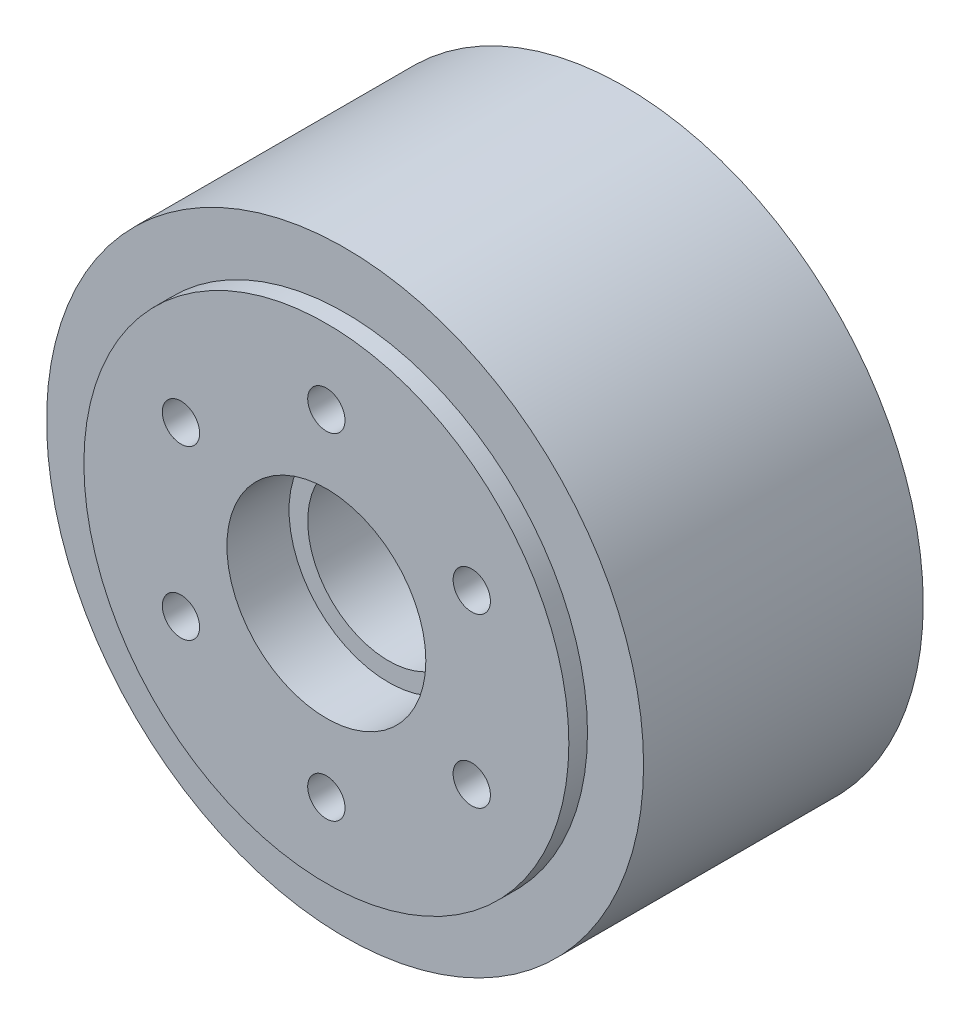
ISO-10303-21;
HEADER;
FILE_DESCRIPTION(('STEP AP214'),'2;1');
FILE_NAME('part.step','',(''),(''),'','','');
FILE_SCHEMA(('AUTOMOTIVE_DESIGN { 1 0 10303 214 1 1 1 1 }'));
ENDSEC;
DATA;
#1=APPLICATION_CONTEXT('core data for automotive mechanical design processes');
#2=APPLICATION_PROTOCOL_DEFINITION('international standard','automotive_design',2000,#1);
#3=PRODUCT_CONTEXT('',#1,'mechanical');
#4=PRODUCT('Part','Part','',(#3));
#5=PRODUCT_RELATED_PRODUCT_CATEGORY('part','',(#4));
#6=PRODUCT_DEFINITION_FORMATION('','',#4);
#7=PRODUCT_DEFINITION_CONTEXT('part definition',#1,'design');
#8=PRODUCT_DEFINITION('design','',#6,#7);
#9=PRODUCT_DEFINITION_SHAPE('','',#8);
#10=(LENGTH_UNIT() NAMED_UNIT(*) SI_UNIT(.MILLI.,.METRE.));
#11=(NAMED_UNIT(*) PLANE_ANGLE_UNIT() SI_UNIT($,.RADIAN.));
#12=(NAMED_UNIT(*) SI_UNIT($,.STERADIAN.) SOLID_ANGLE_UNIT());
#13=UNCERTAINTY_MEASURE_WITH_UNIT(LENGTH_MEASURE(1.E-05),#10,'distance_accuracy_value','');
#14=(GEOMETRIC_REPRESENTATION_CONTEXT(3) GLOBAL_UNCERTAINTY_ASSIGNED_CONTEXT((#13)) GLOBAL_UNIT_ASSIGNED_CONTEXT((#10,
#11,#12)) REPRESENTATION_CONTEXT('',''));
#15=CARTESIAN_POINT('',(0.,0.,0.));
#16=DIRECTION('',(0.,0.,1.));
#17=DIRECTION('',(1.,0.,0.));
#18=AXIS2_PLACEMENT_3D('',#15,#16,#17);
#19=CARTESIAN_POINT('',(0.,48.01,-47.99));
#20=DIRECTION('',(0.,0.,1.));
#21=DIRECTION('',(1.,0.,0.));
#22=AXIS2_PLACEMENT_3D('',#19,#20,#21);
#23=PLANE('',#22);
#24=CARTESIAN_POINT('',(0.,0.,-47.99));
#25=DIRECTION('',(0.,0.,1.));
#26=DIRECTION('',(1.,0.,0.));
#27=AXIS2_PLACEMENT_3D('',#24,#25,#26);
#28=CIRCLE('',#27,48.01);
#29=CARTESIAN_POINT('',(48.01,0.,-47.99));
#30=VERTEX_POINT('',#29);
#31=EDGE_CURVE('E55',#30,#30,#28,.T.);
#32=ORIENTED_EDGE('',*,*,#31,.F.);
#33=EDGE_LOOP('',(#32));
#34=FACE_BOUND('',#33,.T.);
#35=CARTESIAN_POINT('',(0.,0.,-47.99));
#36=DIRECTION('',(0.,0.,1.));
#37=DIRECTION('',(1.,0.,0.));
#38=AXIS2_PLACEMENT_3D('',#35,#36,#37);
#39=CIRCLE('',#38,36.01);
#40=CARTESIAN_POINT('',(36.01,0.,-47.99));
#41=VERTEX_POINT('',#40);
#42=EDGE_CURVE('E11',#41,#41,#39,.T.);
#43=ORIENTED_EDGE('',*,*,#42,.T.);
#44=EDGE_LOOP('',(#43));
#45=FACE_BOUND('',#44,.T.);
#46=ADVANCED_FACE('F41',(#34,#45),#23,.F.);
#47=CARTESIAN_POINT('',(0.,0.,0.));
#48=DIRECTION('',(0.,0.,1.));
#49=DIRECTION('',(1.,0.,0.));
#50=AXIS2_PLACEMENT_3D('',#47,#48,#49);
#51=CYLINDRICAL_SURFACE('',#50,36.01);
#52=ORIENTED_EDGE('',*,*,#42,.F.);
#53=EDGE_LOOP('',(#52));
#54=FACE_BOUND('',#53,.T.);
#55=CARTESIAN_POINT('',(0.,0.,-3.01));
#56=DIRECTION('',(0.,0.,1.));
#57=DIRECTION('',(1.,0.,0.));
#58=AXIS2_PLACEMENT_3D('',#55,#56,#57);
#59=CIRCLE('',#58,36.01);
#60=CARTESIAN_POINT('',(36.01,0.,-3.01));
#61=VERTEX_POINT('',#60);
#62=EDGE_CURVE('E47',#61,#61,#59,.T.);
#63=ORIENTED_EDGE('',*,*,#62,.T.);
#64=EDGE_LOOP('',(#63));
#65=FACE_BOUND('',#64,.T.);
#66=ADVANCED_FACE('F64',(#54,#65),#51,.F.);
#67=CARTESIAN_POINT('',(0.,36.01,-3.01));
#68=DIRECTION('',(0.,0.,-1.));
#69=DIRECTION('',(-1.,0.,0.));
#70=AXIS2_PLACEMENT_3D('',#67,#68,#69);
#71=PLANE('',#70);
#72=ORIENTED_EDGE('',*,*,#62,.F.);
#73=EDGE_LOOP('',(#72));
#74=FACE_BOUND('',#73,.T.);
#75=CARTESIAN_POINT('',(0.,0.,-3.01));
#76=DIRECTION('',(0.,0.,1.));
#77=DIRECTION('',(1.,0.,0.));
#78=AXIS2_PLACEMENT_3D('',#75,#76,#77);
#79=CIRCLE('',#78,48.01);
#80=CARTESIAN_POINT('',(48.01,0.,-3.01));
#81=VERTEX_POINT('',#80);
#82=EDGE_CURVE('E51',#81,#81,#79,.T.);
#83=ORIENTED_EDGE('',*,*,#82,.T.);
#84=EDGE_LOOP('',(#83));
#85=FACE_BOUND('',#84,.T.);
#86=ADVANCED_FACE('F68',(#74,#85),#71,.F.);
#87=CARTESIAN_POINT('',(0.,0.,0.));
#88=DIRECTION('',(0.,0.,1.));
#89=DIRECTION('',(1.,0.,0.));
#90=AXIS2_PLACEMENT_3D('',#87,#88,#89);
#91=CYLINDRICAL_SURFACE('',#90,48.01);
#92=ORIENTED_EDGE('',*,*,#82,.F.);
#93=EDGE_LOOP('',(#92));
#94=FACE_BOUND('',#93,.T.);
#95=ORIENTED_EDGE('',*,*,#31,.T.);
#96=EDGE_LOOP('',(#95));
#97=FACE_BOUND('',#96,.T.);
#98=ADVANCED_FACE('F61',(#94,#97),#91,.T.);
#99=CLOSED_SHELL('',(#46,#66,#86,#98));
#100=MANIFOLD_SOLID_BREP('B2',#99);
#101=CARTESIAN_POINT('',(0.,0.,0.));
#102=DIRECTION('',(0.,0.,1.));
#103=DIRECTION('',(1.,0.,0.));
#104=AXIS2_PLACEMENT_3D('',#101,#102,#103);
#105=CYLINDRICAL_SURFACE('',#104,39.);
#106=CARTESIAN_POINT('',(0.,0.,0.));
#107=DIRECTION('',(0.,0.,1.));
#108=DIRECTION('',(1.,0.,0.));
#109=AXIS2_PLACEMENT_3D('',#106,#107,#108);
#110=CIRCLE('',#109,39.);
#111=CARTESIAN_POINT('',(39.,0.,0.));
#112=VERTEX_POINT('',#111);
#113=EDGE_CURVE('E137',#112,#112,#110,.T.);
#114=ORIENTED_EDGE('',*,*,#113,.F.);
#115=EDGE_LOOP('',(#114));
#116=FACE_BOUND('',#115,.T.);
#117=CARTESIAN_POINT('',(0.,0.,-3.));
#118=DIRECTION('',(0.,0.,1.));
#119=DIRECTION('',(1.,0.,0.));
#120=AXIS2_PLACEMENT_3D('',#117,#118,#119);
#121=CIRCLE('',#120,39.);
#122=CARTESIAN_POINT('',(39.,0.,-3.));
#123=VERTEX_POINT('',#122);
#124=EDGE_CURVE('E40',#123,#123,#121,.T.);
#125=ORIENTED_EDGE('',*,*,#124,.T.);
#126=EDGE_LOOP('',(#125));
#127=FACE_BOUND('',#126,.T.);
#128=ADVANCED_FACE('F103',(#116,#127),#105,.T.);
#129=CARTESIAN_POINT('',(0.,39.,-3.));
#130=DIRECTION('',(0.,0.,1.));
#131=DIRECTION('',(1.,0.,0.));
#132=AXIS2_PLACEMENT_3D('',#129,#130,#131);
#133=PLANE('',#132);
#134=ORIENTED_EDGE('',*,*,#124,.F.);
#135=EDGE_LOOP('',(#134));
#136=FACE_BOUND('',#135,.T.);
#137=CARTESIAN_POINT('',(0.,0.,-3.));
#138=DIRECTION('',(0.,0.,1.));
#139=DIRECTION('',(1.,0.,0.));
#140=AXIS2_PLACEMENT_3D('',#137,#138,#139);
#141=CIRCLE('',#140,36.);
#142=CARTESIAN_POINT('',(36.,0.,-3.));
#143=VERTEX_POINT('',#142);
#144=EDGE_CURVE('E109',#143,#143,#141,.T.);
#145=ORIENTED_EDGE('',*,*,#144,.T.);
#146=EDGE_LOOP('',(#145));
#147=FACE_BOUND('',#146,.T.);
#148=ADVANCED_FACE('F208',(#136,#147),#133,.F.);
#149=CARTESIAN_POINT('',(0.,0.,0.));
#150=DIRECTION('',(0.,0.,1.));
#151=DIRECTION('',(1.,0.,0.));
#152=AXIS2_PLACEMENT_3D('',#149,#150,#151);
#153=CYLINDRICAL_SURFACE('',#152,36.);
#154=ORIENTED_EDGE('',*,*,#144,.F.);
#155=EDGE_LOOP('',(#154));
#156=FACE_BOUND('',#155,.T.);
#157=CARTESIAN_POINT('',(0.,0.,-48.));
#158=DIRECTION('',(0.,0.,1.));
#159=DIRECTION('',(1.,0.,0.));
#160=AXIS2_PLACEMENT_3D('',#157,#158,#159);
#161=CIRCLE('',#160,36.);
#162=CARTESIAN_POINT('',(36.,0.,-48.));
#163=VERTEX_POINT('',#162);
#164=EDGE_CURVE('E113',#163,#163,#161,.T.);
#165=ORIENTED_EDGE('',*,*,#164,.T.);
#166=EDGE_LOOP('',(#165));
#167=FACE_BOUND('',#166,.T.);
#168=ADVANCED_FACE('F212',(#156,#167),#153,.T.);
#169=CARTESIAN_POINT('',(0.,36.,-48.));
#170=DIRECTION('',(0.,0.,1.));
#171=DIRECTION('',(1.,0.,0.));
#172=AXIS2_PLACEMENT_3D('',#169,#170,#171);
#173=PLANE('',#172);
#174=CARTESIAN_POINT('',(0.,27.,-48.));
#175=DIRECTION('',(0.,0.,1.));
#176=DIRECTION('',(1.,0.,0.));
#177=AXIS2_PLACEMENT_3D('',#174,#175,#176);
#178=CIRCLE('',#177,3.);
#179=CARTESIAN_POINT('',(3.,27.,-48.));
#180=VERTEX_POINT('',#179);
#181=EDGE_CURVE('E140',#180,#180,#178,.T.);
#182=ORIENTED_EDGE('',*,*,#181,.T.);
#183=EDGE_LOOP('',(#182));
#184=FACE_BOUND('',#183,.T.);
#185=CARTESIAN_POINT('',(-23.3826859021799,13.5,-48.));
#186=DIRECTION('',(0.,0.,1.));
#187=DIRECTION('',(1.,0.,0.));
#188=AXIS2_PLACEMENT_3D('',#185,#186,#187);
#189=CIRCLE('',#188,3.);
#190=CARTESIAN_POINT('',(-20.3826859021798,13.5,-48.));
#191=VERTEX_POINT('',#190);
#192=EDGE_CURVE('E145',#191,#191,#189,.T.);
#193=ORIENTED_EDGE('',*,*,#192,.T.);
#194=EDGE_LOOP('',(#193));
#195=FACE_BOUND('',#194,.T.);
#196=CARTESIAN_POINT('',(-23.3826859021798,-13.5,-48.));
#197=DIRECTION('',(0.,0.,1.));
#198=DIRECTION('',(1.,0.,0.));
#199=AXIS2_PLACEMENT_3D('',#196,#197,#198);
#200=CIRCLE('',#199,3.);
#201=CARTESIAN_POINT('',(-20.3826859021798,-13.5,-48.));
#202=VERTEX_POINT('',#201);
#203=EDGE_CURVE('E144',#202,#202,#200,.T.);
#204=ORIENTED_EDGE('',*,*,#203,.T.);
#205=EDGE_LOOP('',(#204));
#206=FACE_BOUND('',#205,.T.);
#207=CARTESIAN_POINT('',(0.,-27.,-48.));
#208=DIRECTION('',(0.,0.,1.));
#209=DIRECTION('',(1.,0.,0.));
#210=AXIS2_PLACEMENT_3D('',#207,#208,#209);
#211=CIRCLE('',#210,3.);
#212=CARTESIAN_POINT('',(3.,-27.,-48.));
#213=VERTEX_POINT('',#212);
#214=EDGE_CURVE('E151',#213,#213,#211,.T.);
#215=ORIENTED_EDGE('',*,*,#214,.T.);
#216=EDGE_LOOP('',(#215));
#217=FACE_BOUND('',#216,.T.);
#218=CARTESIAN_POINT('',(23.3826859021798,-13.5,-48.));
#219=DIRECTION('',(0.,0.,1.));
#220=DIRECTION('',(1.,0.,0.));
#221=AXIS2_PLACEMENT_3D('',#218,#219,#220);
#222=CIRCLE('',#221,3.);
#223=CARTESIAN_POINT('',(26.3826859021798,-13.5,-48.));
#224=VERTEX_POINT('',#223);
#225=EDGE_CURVE('E157',#224,#224,#222,.T.);
#226=ORIENTED_EDGE('',*,*,#225,.T.);
#227=EDGE_LOOP('',(#226));
#228=FACE_BOUND('',#227,.T.);
#229=CARTESIAN_POINT('',(23.3826859021798,13.5,-48.));
#230=DIRECTION('',(0.,0.,1.));
#231=DIRECTION('',(1.,0.,0.));
#232=AXIS2_PLACEMENT_3D('',#229,#230,#231);
#233=CIRCLE('',#232,3.);
#234=CARTESIAN_POINT('',(26.3826859021798,13.5,-48.));
#235=VERTEX_POINT('',#234);
#236=EDGE_CURVE('E163',#235,#235,#233,.T.);
#237=ORIENTED_EDGE('',*,*,#236,.T.);
#238=EDGE_LOOP('',(#237));
#239=FACE_BOUND('',#238,.T.);
#240=ORIENTED_EDGE('',*,*,#164,.F.);
#241=EDGE_LOOP('',(#240));
#242=FACE_BOUND('',#241,.T.);
#243=CARTESIAN_POINT('',(0.,0.,-48.));
#244=DIRECTION('',(0.,0.,1.));
#245=DIRECTION('',(1.,0.,0.));
#246=AXIS2_PLACEMENT_3D('',#243,#244,#245);
#247=CIRCLE('',#246,16.);
#248=CARTESIAN_POINT('',(16.,0.,-48.));
#249=VERTEX_POINT('',#248);
#250=EDGE_CURVE('E117',#249,#249,#247,.T.);
#251=ORIENTED_EDGE('',*,*,#250,.T.);
#252=EDGE_LOOP('',(#251));
#253=FACE_BOUND('',#252,.T.);
#254=ADVANCED_FACE('F177',(#184,#195,#206,#217,#228,#239,#242,#253),#173,.F.);
#255=CARTESIAN_POINT('',(0.,0.,0.));
#256=DIRECTION('',(0.,0.,1.));
#257=DIRECTION('',(1.,0.,0.));
#258=AXIS2_PLACEMENT_3D('',#255,#256,#257);
#259=CYLINDRICAL_SURFACE('',#258,16.);
#260=ORIENTED_EDGE('',*,*,#250,.F.);
#261=EDGE_LOOP('',(#260));
#262=FACE_BOUND('',#261,.T.);
#263=CARTESIAN_POINT('',(0.,0.,-38.));
#264=DIRECTION('',(0.,0.,1.));
#265=DIRECTION('',(1.,0.,0.));
#266=AXIS2_PLACEMENT_3D('',#263,#264,#265);
#267=CIRCLE('',#266,16.);
#268=CARTESIAN_POINT('',(16.,0.,-38.));
#269=VERTEX_POINT('',#268);
#270=EDGE_CURVE('E122',#269,#269,#267,.T.);
#271=ORIENTED_EDGE('',*,*,#270,.T.);
#272=EDGE_LOOP('',(#271));
#273=FACE_BOUND('',#272,.T.);
#274=ADVANCED_FACE('F222',(#262,#273),#259,.F.);
#275=CARTESIAN_POINT('',(0.,16.,-38.));
#276=DIRECTION('',(0.,0.,1.));
#277=DIRECTION('',(1.,0.,0.));
#278=AXIS2_PLACEMENT_3D('',#275,#276,#277);
#279=PLANE('',#278);
#280=ORIENTED_EDGE('',*,*,#270,.F.);
#281=EDGE_LOOP('',(#280));
#282=FACE_BOUND('',#281,.T.);
#283=CARTESIAN_POINT('',(0.,0.,-38.));
#284=DIRECTION('',(0.,0.,1.));
#285=DIRECTION('',(1.,0.,0.));
#286=AXIS2_PLACEMENT_3D('',#283,#284,#285);
#287=CIRCLE('',#286,13.);
#288=CARTESIAN_POINT('',(13.,0.,-38.));
#289=VERTEX_POINT('',#288);
#290=EDGE_CURVE('E125',#289,#289,#287,.T.);
#291=ORIENTED_EDGE('',*,*,#290,.T.);
#292=EDGE_LOOP('',(#291));
#293=FACE_BOUND('',#292,.T.);
#294=ADVANCED_FACE('F225',(#282,#293),#279,.F.);
#295=CARTESIAN_POINT('',(0.,0.,0.));
#296=DIRECTION('',(0.,0.,1.));
#297=DIRECTION('',(1.,0.,0.));
#298=AXIS2_PLACEMENT_3D('',#295,#296,#297);
#299=CYLINDRICAL_SURFACE('',#298,13.);
#300=ORIENTED_EDGE('',*,*,#290,.F.);
#301=EDGE_LOOP('',(#300));
#302=FACE_BOUND('',#301,.T.);
#303=CARTESIAN_POINT('',(0.,0.,-10.));
#304=DIRECTION('',(0.,0.,1.));
#305=DIRECTION('',(1.,0.,0.));
#306=AXIS2_PLACEMENT_3D('',#303,#304,#305);
#307=CIRCLE('',#306,13.);
#308=CARTESIAN_POINT('',(13.,0.,-10.));
#309=VERTEX_POINT('',#308);
#310=EDGE_CURVE('E128',#309,#309,#307,.T.);
#311=ORIENTED_EDGE('',*,*,#310,.T.);
#312=EDGE_LOOP('',(#311));
#313=FACE_BOUND('',#312,.T.);
#314=ADVANCED_FACE('F229',(#302,#313),#299,.F.);
#315=CARTESIAN_POINT('',(0.,13.,-10.));
#316=DIRECTION('',(0.,0.,-1.));
#317=DIRECTION('',(-1.,0.,0.));
#318=AXIS2_PLACEMENT_3D('',#315,#316,#317);
#319=PLANE('',#318);
#320=ORIENTED_EDGE('',*,*,#310,.F.);
#321=EDGE_LOOP('',(#320));
#322=FACE_BOUND('',#321,.T.);
#323=CARTESIAN_POINT('',(0.,0.,-10.));
#324=DIRECTION('',(0.,0.,1.));
#325=DIRECTION('',(1.,0.,0.));
#326=AXIS2_PLACEMENT_3D('',#323,#324,#325);
#327=CIRCLE('',#326,16.);
#328=CARTESIAN_POINT('',(16.,0.,-10.));
#329=VERTEX_POINT('',#328);
#330=EDGE_CURVE('E131',#329,#329,#327,.T.);
#331=ORIENTED_EDGE('',*,*,#330,.T.);
#332=EDGE_LOOP('',(#331));
#333=FACE_BOUND('',#332,.T.);
#334=ADVANCED_FACE('F233',(#322,#333),#319,.F.);
#335=CARTESIAN_POINT('',(0.,0.,0.));
#336=DIRECTION('',(0.,0.,1.));
#337=DIRECTION('',(1.,0.,0.));
#338=AXIS2_PLACEMENT_3D('',#335,#336,#337);
#339=CYLINDRICAL_SURFACE('',#338,16.);
#340=ORIENTED_EDGE('',*,*,#330,.F.);
#341=EDGE_LOOP('',(#340));
#342=FACE_BOUND('',#341,.T.);
#343=CARTESIAN_POINT('',(0.,0.,0.));
#344=DIRECTION('',(0.,0.,1.));
#345=DIRECTION('',(1.,0.,0.));
#346=AXIS2_PLACEMENT_3D('',#343,#344,#345);
#347=CIRCLE('',#346,16.);
#348=CARTESIAN_POINT('',(16.,0.,0.));
#349=VERTEX_POINT('',#348);
#350=EDGE_CURVE('E134',#349,#349,#347,.T.);
#351=ORIENTED_EDGE('',*,*,#350,.T.);
#352=EDGE_LOOP('',(#351));
#353=FACE_BOUND('',#352,.T.);
#354=ADVANCED_FACE('F191',(#342,#353),#339,.F.);
#355=CARTESIAN_POINT('',(0.,16.,0.));
#356=DIRECTION('',(0.,0.,-1.));
#357=DIRECTION('',(-1.,0.,0.));
#358=AXIS2_PLACEMENT_3D('',#355,#356,#357);
#359=PLANE('',#358);
#360=CARTESIAN_POINT('',(0.,27.,0.));
#361=DIRECTION('',(0.,0.,1.));
#362=DIRECTION('',(1.,0.,0.));
#363=AXIS2_PLACEMENT_3D('',#360,#361,#362);
#364=CIRCLE('',#363,3.);
#365=CARTESIAN_POINT('',(3.,27.,0.));
#366=VERTEX_POINT('',#365);
#367=EDGE_CURVE('E166',#366,#366,#364,.T.);
#368=ORIENTED_EDGE('',*,*,#367,.F.);
#369=EDGE_LOOP('',(#368));
#370=FACE_BOUND('',#369,.T.);
#371=CARTESIAN_POINT('',(-23.3826859021799,13.5,0.));
#372=DIRECTION('',(0.,0.,1.));
#373=DIRECTION('',(1.,0.,0.));
#374=AXIS2_PLACEMENT_3D('',#371,#372,#373);
#375=CIRCLE('',#374,3.);
#376=CARTESIAN_POINT('',(-20.3826859021798,13.5,0.));
#377=VERTEX_POINT('',#376);
#378=EDGE_CURVE('E167',#377,#377,#375,.T.);
#379=ORIENTED_EDGE('',*,*,#378,.F.);
#380=EDGE_LOOP('',(#379));
#381=FACE_BOUND('',#380,.T.);
#382=CARTESIAN_POINT('',(-23.3826859021798,-13.5,0.));
#383=DIRECTION('',(0.,0.,1.));
#384=DIRECTION('',(1.,0.,0.));
#385=AXIS2_PLACEMENT_3D('',#382,#383,#384);
#386=CIRCLE('',#385,3.);
#387=CARTESIAN_POINT('',(-20.3826859021798,-13.5,0.));
#388=VERTEX_POINT('',#387);
#389=EDGE_CURVE('E141',#388,#388,#386,.T.);
#390=ORIENTED_EDGE('',*,*,#389,.F.);
#391=EDGE_LOOP('',(#390));
#392=FACE_BOUND('',#391,.T.);
#393=CARTESIAN_POINT('',(0.,-27.,0.));
#394=DIRECTION('',(0.,0.,1.));
#395=DIRECTION('',(1.,0.,0.));
#396=AXIS2_PLACEMENT_3D('',#393,#394,#395);
#397=CIRCLE('',#396,3.);
#398=CARTESIAN_POINT('',(3.,-27.,0.));
#399=VERTEX_POINT('',#398);
#400=EDGE_CURVE('E148',#399,#399,#397,.T.);
#401=ORIENTED_EDGE('',*,*,#400,.F.);
#402=EDGE_LOOP('',(#401));
#403=FACE_BOUND('',#402,.T.);
#404=CARTESIAN_POINT('',(23.3826859021798,-13.5,0.));
#405=DIRECTION('',(0.,0.,1.));
#406=DIRECTION('',(1.,0.,0.));
#407=AXIS2_PLACEMENT_3D('',#404,#405,#406);
#408=CIRCLE('',#407,3.);
#409=CARTESIAN_POINT('',(26.3826859021798,-13.5,0.));
#410=VERTEX_POINT('',#409);
#411=EDGE_CURVE('E154',#410,#410,#408,.T.);
#412=ORIENTED_EDGE('',*,*,#411,.F.);
#413=EDGE_LOOP('',(#412));
#414=FACE_BOUND('',#413,.T.);
#415=CARTESIAN_POINT('',(23.3826859021798,13.5,0.));
#416=DIRECTION('',(0.,0.,1.));
#417=DIRECTION('',(1.,0.,0.));
#418=AXIS2_PLACEMENT_3D('',#415,#416,#417);
#419=CIRCLE('',#418,3.);
#420=CARTESIAN_POINT('',(26.3826859021798,13.5,0.));
#421=VERTEX_POINT('',#420);
#422=EDGE_CURVE('E160',#421,#421,#419,.T.);
#423=ORIENTED_EDGE('',*,*,#422,.F.);
#424=EDGE_LOOP('',(#423));
#425=FACE_BOUND('',#424,.T.);
#426=ORIENTED_EDGE('',*,*,#350,.F.);
#427=EDGE_LOOP('',(#426));
#428=FACE_BOUND('',#427,.T.);
#429=ORIENTED_EDGE('',*,*,#113,.T.);
#430=EDGE_LOOP('',(#429));
#431=FACE_BOUND('',#430,.T.);
#432=ADVANCED_FACE('F187',(#370,#381,#392,#403,#414,#425,#428,#431),#359,.F.);
#433=CARTESIAN_POINT('',(23.3826859021798,13.5,-48.));
#434=DIRECTION('',(0.,0.,1.));
#435=DIRECTION('',(1.,0.,0.));
#436=AXIS2_PLACEMENT_3D('',#433,#434,#435);
#437=CYLINDRICAL_SURFACE('',#436,3.);
#438=ORIENTED_EDGE('',*,*,#236,.F.);
#439=EDGE_LOOP('',(#438));
#440=FACE_BOUND('',#439,.T.);
#441=ORIENTED_EDGE('',*,*,#422,.T.);
#442=EDGE_LOOP('',(#441));
#443=FACE_BOUND('',#442,.T.);
#444=ADVANCED_FACE('F190',(#440,#443),#437,.F.);
#445=CARTESIAN_POINT('',(23.3826859021798,-13.5,-48.));
#446=DIRECTION('',(0.,0.,1.));
#447=DIRECTION('',(1.,0.,0.));
#448=AXIS2_PLACEMENT_3D('',#445,#446,#447);
#449=CYLINDRICAL_SURFACE('',#448,3.);
#450=ORIENTED_EDGE('',*,*,#225,.F.);
#451=EDGE_LOOP('',(#450));
#452=FACE_BOUND('',#451,.T.);
#453=ORIENTED_EDGE('',*,*,#411,.T.);
#454=EDGE_LOOP('',(#453));
#455=FACE_BOUND('',#454,.T.);
#456=ADVANCED_FACE('F248',(#452,#455),#449,.F.);
#457=CARTESIAN_POINT('',(0.,-27.,-48.));
#458=DIRECTION('',(0.,0.,1.));
#459=DIRECTION('',(1.,0.,0.));
#460=AXIS2_PLACEMENT_3D('',#457,#458,#459);
#461=CYLINDRICAL_SURFACE('',#460,3.);
#462=ORIENTED_EDGE('',*,*,#214,.F.);
#463=EDGE_LOOP('',(#462));
#464=FACE_BOUND('',#463,.T.);
#465=ORIENTED_EDGE('',*,*,#400,.T.);
#466=EDGE_LOOP('',(#465));
#467=FACE_BOUND('',#466,.T.);
#468=ADVANCED_FACE('F244',(#464,#467),#461,.F.);
#469=CARTESIAN_POINT('',(-23.3826859021798,-13.5,-48.));
#470=DIRECTION('',(0.,0.,1.));
#471=DIRECTION('',(1.,0.,0.));
#472=AXIS2_PLACEMENT_3D('',#469,#470,#471);
#473=CYLINDRICAL_SURFACE('',#472,3.);
#474=ORIENTED_EDGE('',*,*,#203,.F.);
#475=EDGE_LOOP('',(#474));
#476=FACE_BOUND('',#475,.T.);
#477=ORIENTED_EDGE('',*,*,#389,.T.);
#478=EDGE_LOOP('',(#477));
#479=FACE_BOUND('',#478,.T.);
#480=ADVANCED_FACE('F241',(#476,#479),#473,.F.);
#481=CARTESIAN_POINT('',(-23.3826859021799,13.5,-48.));
#482=DIRECTION('',(0.,0.,1.));
#483=DIRECTION('',(1.,0.,0.));
#484=AXIS2_PLACEMENT_3D('',#481,#482,#483);
#485=CYLINDRICAL_SURFACE('',#484,3.);
#486=ORIENTED_EDGE('',*,*,#192,.F.);
#487=EDGE_LOOP('',(#486));
#488=FACE_BOUND('',#487,.T.);
#489=ORIENTED_EDGE('',*,*,#378,.T.);
#490=EDGE_LOOP('',(#489));
#491=FACE_BOUND('',#490,.T.);
#492=ADVANCED_FACE('F183',(#488,#491),#485,.F.);
#493=CARTESIAN_POINT('',(0.,27.,-48.));
#494=DIRECTION('',(0.,0.,1.));
#495=DIRECTION('',(1.,0.,0.));
#496=AXIS2_PLACEMENT_3D('',#493,#494,#495);
#497=CYLINDRICAL_SURFACE('',#496,3.);
#498=ORIENTED_EDGE('',*,*,#181,.F.);
#499=EDGE_LOOP('',(#498));
#500=FACE_BOUND('',#499,.T.);
#501=ORIENTED_EDGE('',*,*,#367,.T.);
#502=EDGE_LOOP('',(#501));
#503=FACE_BOUND('',#502,.T.);
#504=ADVANCED_FACE('F180',(#500,#503),#497,.F.);
#505=CLOSED_SHELL('',(#128,#148,#168,#254,#274,#294,#314,#334,#354,#432,#444,#456,#468,#480,
#492,#504));
#506=MANIFOLD_SOLID_BREP('B6',#505);
#507=ADVANCED_BREP_SHAPE_REPRESENTATION('',(#18,#100,#506),#14);
#508=SHAPE_DEFINITION_REPRESENTATION(#9,#507);
ENDSEC;
END-ISO-10303-21;
